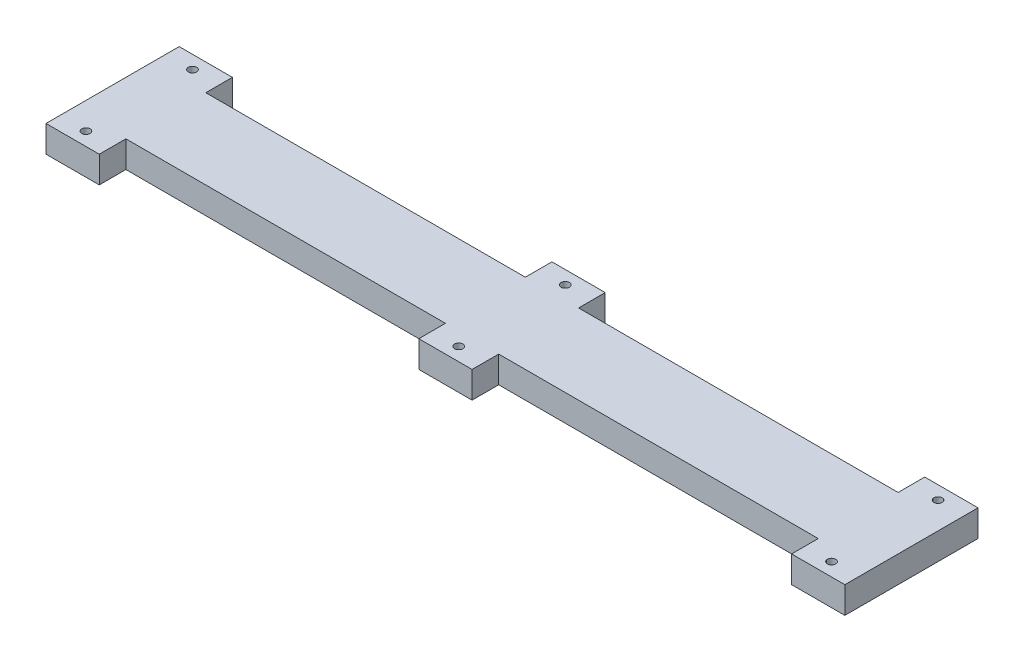
ISO-10303-21;
HEADER;
FILE_DESCRIPTION(('STEP AP214'),'2;1');
FILE_NAME('part.step','',(''),(''),'','','');
FILE_SCHEMA(('AUTOMOTIVE_DESIGN { 1 0 10303 214 1 1 1 1 }'));
ENDSEC;
DATA;
#1=APPLICATION_CONTEXT('core data for automotive mechanical design processes');
#2=APPLICATION_PROTOCOL_DEFINITION('international standard','automotive_design',2000,#1);
#3=PRODUCT_CONTEXT('',#1,'mechanical');
#4=PRODUCT('Part','Part','',(#3));
#5=PRODUCT_RELATED_PRODUCT_CATEGORY('part','',(#4));
#6=PRODUCT_DEFINITION_FORMATION('','',#4);
#7=PRODUCT_DEFINITION_CONTEXT('part definition',#1,'design');
#8=PRODUCT_DEFINITION('design','',#6,#7);
#9=PRODUCT_DEFINITION_SHAPE('','',#8);
#10=(LENGTH_UNIT() NAMED_UNIT(*) SI_UNIT(.MILLI.,.METRE.));
#11=(NAMED_UNIT(*) PLANE_ANGLE_UNIT() SI_UNIT($,.RADIAN.));
#12=(NAMED_UNIT(*) SI_UNIT($,.STERADIAN.) SOLID_ANGLE_UNIT());
#13=UNCERTAINTY_MEASURE_WITH_UNIT(LENGTH_MEASURE(1.E-05),#10,'distance_accuracy_value','');
#14=(GEOMETRIC_REPRESENTATION_CONTEXT(3) GLOBAL_UNCERTAINTY_ASSIGNED_CONTEXT((#13)) GLOBAL_UNIT_ASSIGNED_CONTEXT((#10,
#11,#12)) REPRESENTATION_CONTEXT('',''));
#15=CARTESIAN_POINT('',(0.,0.,0.));
#16=DIRECTION('',(0.,0.,1.));
#17=DIRECTION('',(1.,0.,0.));
#18=AXIS2_PLACEMENT_3D('',#15,#16,#17);
#19=CARTESIAN_POINT('',(-150.,10.,-25.));
#20=DIRECTION('',(0.,0.,1.));
#21=DIRECTION('',(1.,0.,0.));
#22=AXIS2_PLACEMENT_3D('',#19,#20,#21);
#23=PLANE('',#22);
#24=DIRECTION('',(-1.,0.,0.));
#25=VECTOR('',#24,1.);
#26=CARTESIAN_POINT('',(-150.,0.,-25.));
#27=LINE('',#26,#25);
#28=CARTESIAN_POINT('',(150.,0.,-25.));
#29=VERTEX_POINT('',#28);
#30=CARTESIAN_POINT('',(130.,0.,-25.));
#31=VERTEX_POINT('',#30);
#32=EDGE_CURVE('E194',#29,#31,#27,.T.);
#33=ORIENTED_EDGE('',*,*,#32,.T.);
#34=DIRECTION('',(0.,1.,0.));
#35=VECTOR('',#34,1.);
#36=CARTESIAN_POINT('',(130.,0.,-25.));
#37=LINE('',#36,#35);
#38=CARTESIAN_POINT('',(130.,10.,-25.));
#39=VERTEX_POINT('',#38);
#40=EDGE_CURVE('E320',#31,#39,#37,.T.);
#41=ORIENTED_EDGE('',*,*,#40,.T.);
#42=DIRECTION('',(-1.,0.,0.));
#43=VECTOR('',#42,1.);
#44=CARTESIAN_POINT('',(-150.,10.,-25.));
#45=LINE('',#44,#43);
#46=CARTESIAN_POINT('',(150.,10.,-25.));
#47=VERTEX_POINT('',#46);
#48=EDGE_CURVE('E249',#47,#39,#45,.T.);
#49=ORIENTED_EDGE('',*,*,#48,.F.);
#50=DIRECTION('',(0.,-1.,0.));
#51=VECTOR('',#50,1.);
#52=CARTESIAN_POINT('',(150.,10.,-25.));
#53=LINE('',#52,#51);
#54=EDGE_CURVE('E11',#47,#29,#53,.T.);
#55=ORIENTED_EDGE('',*,*,#54,.T.);
#56=EDGE_LOOP('',(#33,#41,#49,#55));
#57=FACE_BOUND('',#56,.T.);
#58=ADVANCED_FACE('F35',(#57),#23,.F.);
#59=CARTESIAN_POINT('',(-130.,10.,-25.));
#60=VERTEX_POINT('',#59);
#61=CARTESIAN_POINT('',(-150.,10.,-25.));
#62=VERTEX_POINT('',#61);
#63=EDGE_CURVE('E252',#60,#62,#45,.T.);
#64=ORIENTED_EDGE('',*,*,#63,.F.);
#65=DIRECTION('',(0.,1.,0.));
#66=VECTOR('',#65,1.);
#67=CARTESIAN_POINT('',(-130.,0.,-25.));
#68=LINE('',#67,#66);
#69=CARTESIAN_POINT('',(-130.,0.,-25.));
#70=VERTEX_POINT('',#69);
#71=EDGE_CURVE('E295',#70,#60,#68,.T.);
#72=ORIENTED_EDGE('',*,*,#71,.F.);
#73=CARTESIAN_POINT('',(-150.,0.,-25.));
#74=VERTEX_POINT('',#73);
#75=EDGE_CURVE('E195',#70,#74,#27,.T.);
#76=ORIENTED_EDGE('',*,*,#75,.T.);
#77=DIRECTION('',(0.,-1.,0.));
#78=VECTOR('',#77,1.);
#79=CARTESIAN_POINT('',(-150.,10.,-25.));
#80=LINE('',#79,#78);
#81=EDGE_CURVE('E43',#62,#74,#80,.T.);
#82=ORIENTED_EDGE('',*,*,#81,.F.);
#83=EDGE_LOOP('',(#64,#72,#76,#82));
#84=FACE_BOUND('',#83,.T.);
#85=ADVANCED_FACE('F442',(#84),#23,.F.);
#86=CARTESIAN_POINT('',(-150.,10.,25.));
#87=DIRECTION('',(0.,0.,-1.));
#88=DIRECTION('',(-1.,0.,0.));
#89=AXIS2_PLACEMENT_3D('',#86,#87,#88);
#90=PLANE('',#89);
#91=DIRECTION('',(1.,0.,0.));
#92=VECTOR('',#91,1.);
#93=CARTESIAN_POINT('',(-150.,0.,25.));
#94=LINE('',#93,#92);
#95=CARTESIAN_POINT('',(-10.,0.,25.));
#96=VERTEX_POINT('',#95);
#97=CARTESIAN_POINT('',(9.99999999999995,0.,25.));
#98=VERTEX_POINT('',#97);
#99=EDGE_CURVE('E209',#96,#98,#94,.T.);
#100=ORIENTED_EDGE('',*,*,#99,.T.);
#101=DIRECTION('',(0.,1.,0.));
#102=VECTOR('',#101,1.);
#103=CARTESIAN_POINT('',(9.99999999999995,0.,25.));
#104=LINE('',#103,#102);
#105=CARTESIAN_POINT('',(9.99999999999995,10.,25.));
#106=VERTEX_POINT('',#105);
#107=EDGE_CURVE('E271',#98,#106,#104,.T.);
#108=ORIENTED_EDGE('',*,*,#107,.T.);
#109=DIRECTION('',(1.,0.,0.));
#110=VECTOR('',#109,1.);
#111=CARTESIAN_POINT('',(-150.,10.,25.));
#112=LINE('',#111,#110);
#113=CARTESIAN_POINT('',(-10.,10.,25.));
#114=VERTEX_POINT('',#113);
#115=EDGE_CURVE('E241',#114,#106,#112,.T.);
#116=ORIENTED_EDGE('',*,*,#115,.F.);
#117=DIRECTION('',(0.,1.,0.));
#118=VECTOR('',#117,1.);
#119=CARTESIAN_POINT('',(-10.,0.,25.));
#120=LINE('',#119,#118);
#121=EDGE_CURVE('E256',#96,#114,#120,.T.);
#122=ORIENTED_EDGE('',*,*,#121,.F.);
#123=EDGE_LOOP('',(#100,#108,#116,#122));
#124=FACE_BOUND('',#123,.T.);
#125=ADVANCED_FACE('F416',(#124),#90,.F.);
#126=CARTESIAN_POINT('',(-150.,0.,25.));
#127=VERTEX_POINT('',#126);
#128=CARTESIAN_POINT('',(-130.,0.,25.));
#129=VERTEX_POINT('',#128);
#130=EDGE_CURVE('E205',#127,#129,#94,.T.);
#131=ORIENTED_EDGE('',*,*,#130,.T.);
#132=DIRECTION('',(0.,1.,0.));
#133=VECTOR('',#132,1.);
#134=CARTESIAN_POINT('',(-130.,0.,25.));
#135=LINE('',#134,#133);
#136=CARTESIAN_POINT('',(-130.,10.,25.));
#137=VERTEX_POINT('',#136);
#138=EDGE_CURVE('E237',#129,#137,#135,.T.);
#139=ORIENTED_EDGE('',*,*,#138,.T.);
#140=CARTESIAN_POINT('',(-150.,10.,25.));
#141=VERTEX_POINT('',#140);
#142=EDGE_CURVE('E214',#141,#137,#112,.T.);
#143=ORIENTED_EDGE('',*,*,#142,.F.);
#144=DIRECTION('',(0.,-1.,0.));
#145=VECTOR('',#144,1.);
#146=CARTESIAN_POINT('',(-150.,10.,25.));
#147=LINE('',#146,#145);
#148=EDGE_CURVE('E213',#141,#127,#147,.T.);
#149=ORIENTED_EDGE('',*,*,#148,.T.);
#150=EDGE_LOOP('',(#131,#139,#143,#149));
#151=FACE_BOUND('',#150,.T.);
#152=ADVANCED_FACE('F235',(#151),#90,.F.);
#153=CARTESIAN_POINT('',(150.,10.,25.));
#154=DIRECTION('',(-1.,0.,0.));
#155=DIRECTION('',(0.,0.,1.));
#156=AXIS2_PLACEMENT_3D('',#153,#154,#155);
#157=PLANE('',#156);
#158=DIRECTION('',(0.,0.,-1.));
#159=VECTOR('',#158,1.);
#160=CARTESIAN_POINT('',(150.,0.,25.));
#161=LINE('',#160,#159);
#162=CARTESIAN_POINT('',(150.,0.,25.));
#163=VERTEX_POINT('',#162);
#164=EDGE_CURVE('E199',#163,#29,#161,.T.);
#165=ORIENTED_EDGE('',*,*,#164,.T.);
#166=ORIENTED_EDGE('',*,*,#54,.F.);
#167=DIRECTION('',(0.,0.,-1.));
#168=VECTOR('',#167,1.);
#169=CARTESIAN_POINT('',(150.,10.,25.));
#170=LINE('',#169,#168);
#171=CARTESIAN_POINT('',(150.,10.,25.));
#172=VERTEX_POINT('',#171);
#173=EDGE_CURVE('E208',#172,#47,#170,.T.);
#174=ORIENTED_EDGE('',*,*,#173,.F.);
#175=DIRECTION('',(0.,-1.,0.));
#176=VECTOR('',#175,1.);
#177=CARTESIAN_POINT('',(150.,10.,25.));
#178=LINE('',#177,#176);
#179=EDGE_CURVE('E210',#172,#163,#178,.T.);
#180=ORIENTED_EDGE('',*,*,#179,.T.);
#181=EDGE_LOOP('',(#165,#166,#174,#180));
#182=FACE_BOUND('',#181,.T.);
#183=ADVANCED_FACE('F37',(#182),#157,.F.);
#184=CARTESIAN_POINT('',(9.99999999999995,10.,-25.));
#185=VERTEX_POINT('',#184);
#186=CARTESIAN_POINT('',(-10.,10.,-25.));
#187=VERTEX_POINT('',#186);
#188=EDGE_CURVE('E188',#185,#187,#45,.T.);
#189=ORIENTED_EDGE('',*,*,#188,.F.);
#190=DIRECTION('',(0.,1.,0.));
#191=VECTOR('',#190,1.);
#192=CARTESIAN_POINT('',(9.99999999999995,0.,-25.));
#193=LINE('',#192,#191);
#194=CARTESIAN_POINT('',(9.99999999999995,0.,-25.));
#195=VERTEX_POINT('',#194);
#196=EDGE_CURVE('E176',#195,#185,#193,.T.);
#197=ORIENTED_EDGE('',*,*,#196,.F.);
#198=CARTESIAN_POINT('',(-10.,0.,-25.));
#199=VERTEX_POINT('',#198);
#200=EDGE_CURVE('E187',#195,#199,#27,.T.);
#201=ORIENTED_EDGE('',*,*,#200,.T.);
#202=DIRECTION('',(0.,1.,0.));
#203=VECTOR('',#202,1.);
#204=CARTESIAN_POINT('',(-10.,0.,-25.));
#205=LINE('',#204,#203);
#206=EDGE_CURVE('E307',#199,#187,#205,.T.);
#207=ORIENTED_EDGE('',*,*,#206,.T.);
#208=EDGE_LOOP('',(#189,#197,#201,#207));
#209=FACE_BOUND('',#208,.T.);
#210=ADVANCED_FACE('F185',(#209),#23,.F.);
#211=CARTESIAN_POINT('',(-150.,10.,25.));
#212=DIRECTION('',(1.,0.,0.));
#213=DIRECTION('',(0.,0.,-1.));
#214=AXIS2_PLACEMENT_3D('',#211,#212,#213);
#215=PLANE('',#214);
#216=DIRECTION('',(0.,0.,1.));
#217=VECTOR('',#216,1.);
#218=CARTESIAN_POINT('',(-150.,0.,25.));
#219=LINE('',#218,#217);
#220=EDGE_CURVE('E198',#74,#127,#219,.T.);
#221=ORIENTED_EDGE('',*,*,#220,.T.);
#222=ORIENTED_EDGE('',*,*,#148,.F.);
#223=DIRECTION('',(0.,0.,1.));
#224=VECTOR('',#223,1.);
#225=CARTESIAN_POINT('',(-150.,10.,25.));
#226=LINE('',#225,#224);
#227=EDGE_CURVE('E223',#62,#141,#226,.T.);
#228=ORIENTED_EDGE('',*,*,#227,.F.);
#229=ORIENTED_EDGE('',*,*,#81,.T.);
#230=EDGE_LOOP('',(#221,#222,#228,#229));
#231=FACE_BOUND('',#230,.T.);
#232=ADVANCED_FACE('F221',(#231),#215,.F.);
#233=CARTESIAN_POINT('',(130.,10.,25.));
#234=VERTEX_POINT('',#233);
#235=EDGE_CURVE('E242',#234,#172,#112,.T.);
#236=ORIENTED_EDGE('',*,*,#235,.F.);
#237=DIRECTION('',(0.,1.,0.));
#238=VECTOR('',#237,1.);
#239=CARTESIAN_POINT('',(130.,0.,25.));
#240=LINE('',#239,#238);
#241=CARTESIAN_POINT('',(130.,0.,25.));
#242=VERTEX_POINT('',#241);
#243=EDGE_CURVE('E277',#242,#234,#240,.T.);
#244=ORIENTED_EDGE('',*,*,#243,.F.);
#245=EDGE_CURVE('E204',#242,#163,#94,.T.);
#246=ORIENTED_EDGE('',*,*,#245,.T.);
#247=ORIENTED_EDGE('',*,*,#179,.F.);
#248=EDGE_LOOP('',(#236,#244,#246,#247));
#249=FACE_BOUND('',#248,.T.);
#250=ADVANCED_FACE('F387',(#249),#90,.F.);
#251=CARTESIAN_POINT('',(0.,10.,0.));
#252=DIRECTION('',(0.,-1.,0.));
#253=DIRECTION('',(0.,0.,-1.));
#254=AXIS2_PLACEMENT_3D('',#251,#252,#253);
#255=PLANE('',#254);
#256=CARTESIAN_POINT('',(140.,10.,20.));
#257=DIRECTION('',(0.,1.,0.));
#258=DIRECTION('',(0.,0.,1.));
#259=AXIS2_PLACEMENT_3D('',#256,#257,#258);
#260=CIRCLE('',#259,1.54999999999999);
#261=CARTESIAN_POINT('',(140.,10.,21.55));
#262=VERTEX_POINT('',#261);
#263=EDGE_CURVE('E369',#262,#262,#260,.T.);
#264=ORIENTED_EDGE('',*,*,#263,.F.);
#265=EDGE_LOOP('',(#264));
#266=FACE_BOUND('',#265,.T.);
#267=CARTESIAN_POINT('',(-140.,10.,20.000000000002));
#268=DIRECTION('',(0.,1.,0.));
#269=DIRECTION('',(0.,0.,1.));
#270=AXIS2_PLACEMENT_3D('',#267,#268,#269);
#271=CIRCLE('',#270,1.54999999999999);
#272=CARTESIAN_POINT('',(-140.,10.,21.550000000002));
#273=VERTEX_POINT('',#272);
#274=EDGE_CURVE('E363',#273,#273,#271,.T.);
#275=ORIENTED_EDGE('',*,*,#274,.F.);
#276=EDGE_LOOP('',(#275));
#277=FACE_BOUND('',#276,.T.);
#278=CARTESIAN_POINT('',(3.60822483003176E-13,10.,20.000000000001));
#279=DIRECTION('',(0.,1.,0.));
#280=DIRECTION('',(0.,0.,1.));
#281=AXIS2_PLACEMENT_3D('',#278,#279,#280);
#282=CIRCLE('',#281,1.54999999999999);
#283=CARTESIAN_POINT('',(3.60822483003176E-13,10.,21.550000000001));
#284=VERTEX_POINT('',#283);
#285=EDGE_CURVE('E357',#284,#284,#282,.T.);
#286=ORIENTED_EDGE('',*,*,#285,.F.);
#287=EDGE_LOOP('',(#286));
#288=FACE_BOUND('',#287,.T.);
#289=CARTESIAN_POINT('',(-140.,10.,-19.999999999998));
#290=DIRECTION('',(0.,1.,0.));
#291=DIRECTION('',(0.,0.,1.));
#292=AXIS2_PLACEMENT_3D('',#289,#290,#291);
#293=CIRCLE('',#292,1.54999999999999);
#294=CARTESIAN_POINT('',(-140.,10.,-18.449999999998));
#295=VERTEX_POINT('',#294);
#296=EDGE_CURVE('E351',#295,#295,#293,.T.);
#297=ORIENTED_EDGE('',*,*,#296,.F.);
#298=EDGE_LOOP('',(#297));
#299=FACE_BOUND('',#298,.T.);
#300=CARTESIAN_POINT('',(0.,10.,-19.999999999999));
#301=DIRECTION('',(0.,1.,0.));
#302=DIRECTION('',(0.,0.,1.));
#303=AXIS2_PLACEMENT_3D('',#300,#301,#302);
#304=CIRCLE('',#303,1.54999999999999);
#305=CARTESIAN_POINT('',(0.,10.,-18.449999999999));
#306=VERTEX_POINT('',#305);
#307=EDGE_CURVE('E345',#306,#306,#304,.T.);
#308=ORIENTED_EDGE('',*,*,#307,.F.);
#309=EDGE_LOOP('',(#308));
#310=FACE_BOUND('',#309,.T.);
#311=CARTESIAN_POINT('',(140.,10.,-20.));
#312=DIRECTION('',(0.,1.,0.));
#313=DIRECTION('',(0.,0.,1.));
#314=AXIS2_PLACEMENT_3D('',#311,#312,#313);
#315=CIRCLE('',#314,1.54999999999999);
#316=CARTESIAN_POINT('',(140.,10.,-18.45));
#317=VERTEX_POINT('',#316);
#318=EDGE_CURVE('E339',#317,#317,#315,.T.);
#319=ORIENTED_EDGE('',*,*,#318,.F.);
#320=EDGE_LOOP('',(#319));
#321=FACE_BOUND('',#320,.T.);
#322=ORIENTED_EDGE('',*,*,#48,.T.);
#323=DIRECTION('',(0.,0.,-1.));
#324=VECTOR('',#323,1.);
#325=CARTESIAN_POINT('',(130.,10.,-25.));
#326=LINE('',#325,#324);
#327=CARTESIAN_POINT('',(130.,10.,-15.0000000000001));
#328=VERTEX_POINT('',#327);
#329=EDGE_CURVE('E181',#328,#39,#326,.T.);
#330=ORIENTED_EDGE('',*,*,#329,.F.);
#331=DIRECTION('',(1.,0.,0.));
#332=VECTOR('',#331,1.);
#333=CARTESIAN_POINT('',(9.99999999999996,10.,-15.0000000000001));
#334=LINE('',#333,#332);
#335=CARTESIAN_POINT('',(9.99999999999996,10.,-15.0000000000001));
#336=VERTEX_POINT('',#335);
#337=EDGE_CURVE('E331',#336,#328,#334,.T.);
#338=ORIENTED_EDGE('',*,*,#337,.F.);
#339=DIRECTION('',(0.,0.,1.));
#340=VECTOR('',#339,1.);
#341=CARTESIAN_POINT('',(9.99999999999995,10.,-25.));
#342=LINE('',#341,#340);
#343=EDGE_CURVE('E334',#185,#336,#342,.T.);
#344=ORIENTED_EDGE('',*,*,#343,.F.);
#345=ORIENTED_EDGE('',*,*,#188,.T.);
#346=DIRECTION('',(0.,0.,-1.));
#347=VECTOR('',#346,1.);
#348=CARTESIAN_POINT('',(-10.,10.,-25.));
#349=LINE('',#348,#347);
#350=CARTESIAN_POINT('',(-10.,10.,-15.));
#351=VERTEX_POINT('',#350);
#352=EDGE_CURVE('E310',#351,#187,#349,.T.);
#353=ORIENTED_EDGE('',*,*,#352,.F.);
#354=DIRECTION('',(1.,0.,0.));
#355=VECTOR('',#354,1.);
#356=CARTESIAN_POINT('',(-130.,10.,-15.));
#357=LINE('',#356,#355);
#358=CARTESIAN_POINT('',(-130.,10.,-15.));
#359=VERTEX_POINT('',#358);
#360=EDGE_CURVE('E314',#359,#351,#357,.T.);
#361=ORIENTED_EDGE('',*,*,#360,.F.);
#362=DIRECTION('',(0.,0.,1.));
#363=VECTOR('',#362,1.);
#364=CARTESIAN_POINT('',(-130.,10.,-25.));
#365=LINE('',#364,#363);
#366=EDGE_CURVE('E317',#60,#359,#365,.T.);
#367=ORIENTED_EDGE('',*,*,#366,.F.);
#368=ORIENTED_EDGE('',*,*,#63,.T.);
#369=ORIENTED_EDGE('',*,*,#227,.T.);
#370=ORIENTED_EDGE('',*,*,#142,.T.);
#371=DIRECTION('',(0.,0.,1.));
#372=VECTOR('',#371,1.);
#373=CARTESIAN_POINT('',(-130.,10.,25.));
#374=LINE('',#373,#372);
#375=CARTESIAN_POINT('',(-130.,10.,15.));
#376=VERTEX_POINT('',#375);
#377=EDGE_CURVE('E269',#376,#137,#374,.T.);
#378=ORIENTED_EDGE('',*,*,#377,.F.);
#379=DIRECTION('',(-1.,0.,0.));
#380=VECTOR('',#379,1.);
#381=CARTESIAN_POINT('',(-130.,10.,15.));
#382=LINE('',#381,#380);
#383=CARTESIAN_POINT('',(-10.,10.,15.));
#384=VERTEX_POINT('',#383);
#385=EDGE_CURVE('E263',#384,#376,#382,.T.);
#386=ORIENTED_EDGE('',*,*,#385,.F.);
#387=DIRECTION('',(0.,0.,-1.));
#388=VECTOR('',#387,1.);
#389=CARTESIAN_POINT('',(-10.,10.,25.));
#390=LINE('',#389,#388);
#391=EDGE_CURVE('E266',#114,#384,#390,.T.);
#392=ORIENTED_EDGE('',*,*,#391,.F.);
#393=ORIENTED_EDGE('',*,*,#115,.T.);
#394=DIRECTION('',(0.,0.,1.));
#395=VECTOR('',#394,1.);
#396=CARTESIAN_POINT('',(9.99999999999995,10.,25.));
#397=LINE('',#396,#395);
#398=CARTESIAN_POINT('',(9.99999999999997,10.,14.9999999999999));
#399=VERTEX_POINT('',#398);
#400=EDGE_CURVE('E286',#399,#106,#397,.T.);
#401=ORIENTED_EDGE('',*,*,#400,.F.);
#402=DIRECTION('',(-1.,0.,0.));
#403=VECTOR('',#402,1.);
#404=CARTESIAN_POINT('',(9.99999999999997,10.,14.9999999999999));
#405=LINE('',#404,#403);
#406=CARTESIAN_POINT('',(130.,10.,14.9999999999999));
#407=VERTEX_POINT('',#406);
#408=EDGE_CURVE('E289',#407,#399,#405,.T.);
#409=ORIENTED_EDGE('',*,*,#408,.F.);
#410=DIRECTION('',(0.,0.,-1.));
#411=VECTOR('',#410,1.);
#412=CARTESIAN_POINT('',(130.,10.,25.));
#413=LINE('',#412,#411);
#414=EDGE_CURVE('E292',#234,#407,#413,.T.);
#415=ORIENTED_EDGE('',*,*,#414,.F.);
#416=ORIENTED_EDGE('',*,*,#235,.T.);
#417=ORIENTED_EDGE('',*,*,#173,.T.);
#418=EDGE_LOOP('',(#322,#330,#338,#344,#345,#353,#361,#367,#368,#369,#370,#378,#386,#392,#393,
#401,#409,#415,#416,#417));
#419=FACE_BOUND('',#418,.T.);
#420=ADVANCED_FACE('F384',(#266,#277,#288,#299,#310,#321,#419),#255,.F.);
#421=CARTESIAN_POINT('',(0.,0.,0.));
#422=DIRECTION('',(0.,-1.,0.));
#423=DIRECTION('',(0.,0.,-1.));
#424=AXIS2_PLACEMENT_3D('',#421,#422,#423);
#425=PLANE('',#424);
#426=CARTESIAN_POINT('',(140.,0.,20.));
#427=DIRECTION('',(0.,1.,0.));
#428=DIRECTION('',(0.,0.,1.));
#429=AXIS2_PLACEMENT_3D('',#426,#427,#428);
#430=CIRCLE('',#429,1.54999999999999);
#431=CARTESIAN_POINT('',(140.,0.,21.55));
#432=VERTEX_POINT('',#431);
#433=EDGE_CURVE('E366',#432,#432,#430,.T.);
#434=ORIENTED_EDGE('',*,*,#433,.T.);
#435=EDGE_LOOP('',(#434));
#436=FACE_BOUND('',#435,.T.);
#437=CARTESIAN_POINT('',(-140.,0.,20.000000000002));
#438=DIRECTION('',(0.,1.,0.));
#439=DIRECTION('',(0.,0.,1.));
#440=AXIS2_PLACEMENT_3D('',#437,#438,#439);
#441=CIRCLE('',#440,1.54999999999999);
#442=CARTESIAN_POINT('',(-140.,0.,21.550000000002));
#443=VERTEX_POINT('',#442);
#444=EDGE_CURVE('E360',#443,#443,#441,.T.);
#445=ORIENTED_EDGE('',*,*,#444,.T.);
#446=EDGE_LOOP('',(#445));
#447=FACE_BOUND('',#446,.T.);
#448=CARTESIAN_POINT('',(3.60822483003176E-13,0.,20.000000000001));
#449=DIRECTION('',(0.,1.,0.));
#450=DIRECTION('',(0.,0.,1.));
#451=AXIS2_PLACEMENT_3D('',#448,#449,#450);
#452=CIRCLE('',#451,1.54999999999999);
#453=CARTESIAN_POINT('',(3.60822483003176E-13,0.,21.550000000001));
#454=VERTEX_POINT('',#453);
#455=EDGE_CURVE('E354',#454,#454,#452,.T.);
#456=ORIENTED_EDGE('',*,*,#455,.T.);
#457=EDGE_LOOP('',(#456));
#458=FACE_BOUND('',#457,.T.);
#459=CARTESIAN_POINT('',(-140.,0.,-19.999999999998));
#460=DIRECTION('',(0.,1.,0.));
#461=DIRECTION('',(0.,0.,1.));
#462=AXIS2_PLACEMENT_3D('',#459,#460,#461);
#463=CIRCLE('',#462,1.54999999999999);
#464=CARTESIAN_POINT('',(-140.,0.,-18.449999999998));
#465=VERTEX_POINT('',#464);
#466=EDGE_CURVE('E348',#465,#465,#463,.T.);
#467=ORIENTED_EDGE('',*,*,#466,.T.);
#468=EDGE_LOOP('',(#467));
#469=FACE_BOUND('',#468,.T.);
#470=CARTESIAN_POINT('',(0.,0.,-19.999999999999));
#471=DIRECTION('',(0.,1.,0.));
#472=DIRECTION('',(0.,0.,1.));
#473=AXIS2_PLACEMENT_3D('',#470,#471,#472);
#474=CIRCLE('',#473,1.54999999999999);
#475=CARTESIAN_POINT('',(0.,0.,-18.449999999999));
#476=VERTEX_POINT('',#475);
#477=EDGE_CURVE('E342',#476,#476,#474,.T.);
#478=ORIENTED_EDGE('',*,*,#477,.T.);
#479=EDGE_LOOP('',(#478));
#480=FACE_BOUND('',#479,.T.);
#481=CARTESIAN_POINT('',(140.,0.,-20.));
#482=DIRECTION('',(0.,1.,0.));
#483=DIRECTION('',(0.,0.,1.));
#484=AXIS2_PLACEMENT_3D('',#481,#482,#483);
#485=CIRCLE('',#484,1.54999999999999);
#486=CARTESIAN_POINT('',(140.,0.,-18.45));
#487=VERTEX_POINT('',#486);
#488=EDGE_CURVE('E336',#487,#487,#485,.T.);
#489=ORIENTED_EDGE('',*,*,#488,.T.);
#490=EDGE_LOOP('',(#489));
#491=FACE_BOUND('',#490,.T.);
#492=DIRECTION('',(0.,0.,-1.));
#493=VECTOR('',#492,1.);
#494=CARTESIAN_POINT('',(130.,0.,-25.));
#495=LINE('',#494,#493);
#496=CARTESIAN_POINT('',(130.,0.,-15.0000000000001));
#497=VERTEX_POINT('',#496);
#498=EDGE_CURVE('E189',#497,#31,#495,.T.);
#499=ORIENTED_EDGE('',*,*,#498,.T.);
#500=ORIENTED_EDGE('',*,*,#32,.F.);
#501=ORIENTED_EDGE('',*,*,#164,.F.);
#502=ORIENTED_EDGE('',*,*,#245,.F.);
#503=DIRECTION('',(0.,0.,-1.));
#504=VECTOR('',#503,1.);
#505=CARTESIAN_POINT('',(130.,0.,25.));
#506=LINE('',#505,#504);
#507=CARTESIAN_POINT('',(130.,0.,14.9999999999999));
#508=VERTEX_POINT('',#507);
#509=EDGE_CURVE('E288',#242,#508,#506,.T.);
#510=ORIENTED_EDGE('',*,*,#509,.T.);
#511=DIRECTION('',(-1.,0.,0.));
#512=VECTOR('',#511,1.);
#513=CARTESIAN_POINT('',(9.99999999999997,0.,14.9999999999999));
#514=LINE('',#513,#512);
#515=CARTESIAN_POINT('',(9.99999999999997,0.,14.9999999999999));
#516=VERTEX_POINT('',#515);
#517=EDGE_CURVE('E298',#508,#516,#514,.T.);
#518=ORIENTED_EDGE('',*,*,#517,.T.);
#519=DIRECTION('',(0.,0.,1.));
#520=VECTOR('',#519,1.);
#521=CARTESIAN_POINT('',(9.99999999999995,0.,25.));
#522=LINE('',#521,#520);
#523=EDGE_CURVE('E280',#516,#98,#522,.T.);
#524=ORIENTED_EDGE('',*,*,#523,.T.);
#525=ORIENTED_EDGE('',*,*,#99,.F.);
#526=DIRECTION('',(0.,0.,-1.));
#527=VECTOR('',#526,1.);
#528=CARTESIAN_POINT('',(-10.,0.,25.));
#529=LINE('',#528,#527);
#530=CARTESIAN_POINT('',(-10.,0.,15.));
#531=VERTEX_POINT('',#530);
#532=EDGE_CURVE('E273',#96,#531,#529,.T.);
#533=ORIENTED_EDGE('',*,*,#532,.T.);
#534=DIRECTION('',(-1.,0.,0.));
#535=VECTOR('',#534,1.);
#536=CARTESIAN_POINT('',(-130.,0.,15.));
#537=LINE('',#536,#535);
#538=CARTESIAN_POINT('',(-130.,0.,15.));
#539=VERTEX_POINT('',#538);
#540=EDGE_CURVE('E257',#531,#539,#537,.T.);
#541=ORIENTED_EDGE('',*,*,#540,.T.);
#542=DIRECTION('',(0.,0.,1.));
#543=VECTOR('',#542,1.);
#544=CARTESIAN_POINT('',(-130.,0.,25.));
#545=LINE('',#544,#543);
#546=EDGE_CURVE('E232',#539,#129,#545,.T.);
#547=ORIENTED_EDGE('',*,*,#546,.T.);
#548=ORIENTED_EDGE('',*,*,#130,.F.);
#549=ORIENTED_EDGE('',*,*,#220,.F.);
#550=ORIENTED_EDGE('',*,*,#75,.F.);
#551=DIRECTION('',(0.,0.,1.));
#552=VECTOR('',#551,1.);
#553=CARTESIAN_POINT('',(-130.,0.,-25.));
#554=LINE('',#553,#552);
#555=CARTESIAN_POINT('',(-130.,0.,-15.));
#556=VERTEX_POINT('',#555);
#557=EDGE_CURVE('E313',#70,#556,#554,.T.);
#558=ORIENTED_EDGE('',*,*,#557,.T.);
#559=DIRECTION('',(1.,0.,0.));
#560=VECTOR('',#559,1.);
#561=CARTESIAN_POINT('',(-130.,0.,-15.));
#562=LINE('',#561,#560);
#563=CARTESIAN_POINT('',(-10.,0.,-15.));
#564=VERTEX_POINT('',#563);
#565=EDGE_CURVE('E322',#556,#564,#562,.T.);
#566=ORIENTED_EDGE('',*,*,#565,.T.);
#567=DIRECTION('',(0.,0.,-1.));
#568=VECTOR('',#567,1.);
#569=CARTESIAN_POINT('',(-10.,0.,-25.));
#570=LINE('',#569,#568);
#571=EDGE_CURVE('E58',#564,#199,#570,.T.);
#572=ORIENTED_EDGE('',*,*,#571,.T.);
#573=ORIENTED_EDGE('',*,*,#200,.F.);
#574=DIRECTION('',(0.,0.,1.));
#575=VECTOR('',#574,1.);
#576=CARTESIAN_POINT('',(9.99999999999995,0.,-25.));
#577=LINE('',#576,#575);
#578=CARTESIAN_POINT('',(9.99999999999996,0.,-15.0000000000001));
#579=VERTEX_POINT('',#578);
#580=EDGE_CURVE('E172',#195,#579,#577,.T.);
#581=ORIENTED_EDGE('',*,*,#580,.T.);
#582=DIRECTION('',(1.,0.,0.));
#583=VECTOR('',#582,1.);
#584=CARTESIAN_POINT('',(9.99999999999996,0.,-15.0000000000001));
#585=LINE('',#584,#583);
#586=EDGE_CURVE('E50',#579,#497,#585,.T.);
#587=ORIENTED_EDGE('',*,*,#586,.T.);
#588=EDGE_LOOP('',(#499,#500,#501,#502,#510,#518,#524,#525,#533,#541,#547,#548,#549,#550,#558,
#566,#572,#573,#581,#587));
#589=FACE_BOUND('',#588,.T.);
#590=ADVANCED_FACE('F192',(#436,#447,#458,#469,#480,#491,#589),#425,.T.);
#591=CARTESIAN_POINT('',(-130.,0.,25.));
#592=DIRECTION('',(-1.,0.,0.));
#593=DIRECTION('',(0.,0.,1.));
#594=AXIS2_PLACEMENT_3D('',#591,#592,#593);
#595=PLANE('',#594);
#596=ORIENTED_EDGE('',*,*,#377,.T.);
#597=ORIENTED_EDGE('',*,*,#138,.F.);
#598=ORIENTED_EDGE('',*,*,#546,.F.);
#599=DIRECTION('',(0.,1.,0.));
#600=VECTOR('',#599,1.);
#601=CARTESIAN_POINT('',(-130.,0.,15.));
#602=LINE('',#601,#600);
#603=EDGE_CURVE('E261',#539,#376,#602,.T.);
#604=ORIENTED_EDGE('',*,*,#603,.T.);
#605=EDGE_LOOP('',(#596,#597,#598,#604));
#606=FACE_BOUND('',#605,.T.);
#607=ADVANCED_FACE('F431',(#606),#595,.F.);
#608=CARTESIAN_POINT('',(-130.,0.,15.));
#609=DIRECTION('',(0.,0.,-1.));
#610=DIRECTION('',(-1.,0.,0.));
#611=AXIS2_PLACEMENT_3D('',#608,#609,#610);
#612=PLANE('',#611);
#613=ORIENTED_EDGE('',*,*,#385,.T.);
#614=ORIENTED_EDGE('',*,*,#603,.F.);
#615=ORIENTED_EDGE('',*,*,#540,.F.);
#616=DIRECTION('',(0.,1.,0.));
#617=VECTOR('',#616,1.);
#618=CARTESIAN_POINT('',(-10.,0.,15.));
#619=LINE('',#618,#617);
#620=EDGE_CURVE('E259',#531,#384,#619,.T.);
#621=ORIENTED_EDGE('',*,*,#620,.T.);
#622=EDGE_LOOP('',(#613,#614,#615,#621));
#623=FACE_BOUND('',#622,.T.);
#624=ADVANCED_FACE('F429',(#623),#612,.F.);
#625=CARTESIAN_POINT('',(-10.,0.,25.));
#626=DIRECTION('',(1.,0.,0.));
#627=DIRECTION('',(0.,0.,-1.));
#628=AXIS2_PLACEMENT_3D('',#625,#626,#627);
#629=PLANE('',#628);
#630=ORIENTED_EDGE('',*,*,#391,.T.);
#631=ORIENTED_EDGE('',*,*,#620,.F.);
#632=ORIENTED_EDGE('',*,*,#532,.F.);
#633=ORIENTED_EDGE('',*,*,#121,.T.);
#634=EDGE_LOOP('',(#630,#631,#632,#633));
#635=FACE_BOUND('',#634,.T.);
#636=ADVANCED_FACE('F427',(#635),#629,.F.);
#637=CARTESIAN_POINT('',(9.99999999999995,0.,25.));
#638=DIRECTION('',(-1.,0.,0.));
#639=DIRECTION('',(0.,0.,1.));
#640=AXIS2_PLACEMENT_3D('',#637,#638,#639);
#641=PLANE('',#640);
#642=ORIENTED_EDGE('',*,*,#400,.T.);
#643=ORIENTED_EDGE('',*,*,#107,.F.);
#644=ORIENTED_EDGE('',*,*,#523,.F.);
#645=DIRECTION('',(0.,1.,0.));
#646=VECTOR('',#645,1.);
#647=CARTESIAN_POINT('',(9.99999999999997,0.,14.9999999999999));
#648=LINE('',#647,#646);
#649=EDGE_CURVE('E282',#516,#399,#648,.T.);
#650=ORIENTED_EDGE('',*,*,#649,.T.);
#651=EDGE_LOOP('',(#642,#643,#644,#650));
#652=FACE_BOUND('',#651,.T.);
#653=ADVANCED_FACE('F420',(#652),#641,.F.);
#654=CARTESIAN_POINT('',(9.99999999999997,0.,14.9999999999999));
#655=DIRECTION('',(0.,0.,-1.));
#656=DIRECTION('',(-1.,0.,0.));
#657=AXIS2_PLACEMENT_3D('',#654,#655,#656);
#658=PLANE('',#657);
#659=ORIENTED_EDGE('',*,*,#408,.T.);
#660=ORIENTED_EDGE('',*,*,#649,.F.);
#661=ORIENTED_EDGE('',*,*,#517,.F.);
#662=DIRECTION('',(0.,1.,0.));
#663=VECTOR('',#662,1.);
#664=CARTESIAN_POINT('',(130.,0.,14.9999999999999));
#665=LINE('',#664,#663);
#666=EDGE_CURVE('E279',#508,#407,#665,.T.);
#667=ORIENTED_EDGE('',*,*,#666,.T.);
#668=EDGE_LOOP('',(#659,#660,#661,#667));
#669=FACE_BOUND('',#668,.T.);
#670=ADVANCED_FACE('F500',(#669),#658,.F.);
#671=CARTESIAN_POINT('',(130.,0.,25.));
#672=DIRECTION('',(1.,0.,0.));
#673=DIRECTION('',(0.,0.,-1.));
#674=AXIS2_PLACEMENT_3D('',#671,#672,#673);
#675=PLANE('',#674);
#676=ORIENTED_EDGE('',*,*,#414,.T.);
#677=ORIENTED_EDGE('',*,*,#666,.F.);
#678=ORIENTED_EDGE('',*,*,#509,.F.);
#679=ORIENTED_EDGE('',*,*,#243,.T.);
#680=EDGE_LOOP('',(#676,#677,#678,#679));
#681=FACE_BOUND('',#680,.T.);
#682=ADVANCED_FACE('F509',(#681),#675,.F.);
#683=CARTESIAN_POINT('',(-130.,0.,-25.));
#684=DIRECTION('',(-1.,0.,0.));
#685=DIRECTION('',(0.,0.,1.));
#686=AXIS2_PLACEMENT_3D('',#683,#684,#685);
#687=PLANE('',#686);
#688=ORIENTED_EDGE('',*,*,#366,.T.);
#689=DIRECTION('',(0.,1.,0.));
#690=VECTOR('',#689,1.);
#691=CARTESIAN_POINT('',(-130.,0.,-15.));
#692=LINE('',#691,#690);
#693=EDGE_CURVE('E303',#556,#359,#692,.T.);
#694=ORIENTED_EDGE('',*,*,#693,.F.);
#695=ORIENTED_EDGE('',*,*,#557,.F.);
#696=ORIENTED_EDGE('',*,*,#71,.T.);
#697=EDGE_LOOP('',(#688,#694,#695,#696));
#698=FACE_BOUND('',#697,.T.);
#699=ADVANCED_FACE('F519',(#698),#687,.F.);
#700=CARTESIAN_POINT('',(-10.,0.,-25.));
#701=DIRECTION('',(1.,0.,0.));
#702=DIRECTION('',(0.,0.,-1.));
#703=AXIS2_PLACEMENT_3D('',#700,#701,#702);
#704=PLANE('',#703);
#705=ORIENTED_EDGE('',*,*,#352,.T.);
#706=ORIENTED_EDGE('',*,*,#206,.F.);
#707=ORIENTED_EDGE('',*,*,#571,.F.);
#708=DIRECTION('',(0.,1.,0.));
#709=VECTOR('',#708,1.);
#710=CARTESIAN_POINT('',(-10.,0.,-15.));
#711=LINE('',#710,#709);
#712=EDGE_CURVE('E305',#564,#351,#711,.T.);
#713=ORIENTED_EDGE('',*,*,#712,.T.);
#714=EDGE_LOOP('',(#705,#706,#707,#713));
#715=FACE_BOUND('',#714,.T.);
#716=ADVANCED_FACE('F529',(#715),#704,.F.);
#717=CARTESIAN_POINT('',(-130.,0.,-15.));
#718=DIRECTION('',(0.,0.,1.));
#719=DIRECTION('',(1.,0.,0.));
#720=AXIS2_PLACEMENT_3D('',#717,#718,#719);
#721=PLANE('',#720);
#722=ORIENTED_EDGE('',*,*,#360,.T.);
#723=ORIENTED_EDGE('',*,*,#712,.F.);
#724=ORIENTED_EDGE('',*,*,#565,.F.);
#725=ORIENTED_EDGE('',*,*,#693,.T.);
#726=EDGE_LOOP('',(#722,#723,#724,#725));
#727=FACE_BOUND('',#726,.T.);
#728=ADVANCED_FACE('F539',(#727),#721,.F.);
#729=CARTESIAN_POINT('',(130.,0.,-25.));
#730=DIRECTION('',(1.,0.,0.));
#731=DIRECTION('',(0.,0.,-1.));
#732=AXIS2_PLACEMENT_3D('',#729,#730,#731);
#733=PLANE('',#732);
#734=ORIENTED_EDGE('',*,*,#329,.T.);
#735=ORIENTED_EDGE('',*,*,#40,.F.);
#736=ORIENTED_EDGE('',*,*,#498,.F.);
#737=DIRECTION('',(0.,1.,0.));
#738=VECTOR('',#737,1.);
#739=CARTESIAN_POINT('',(130.,0.,-15.0000000000001));
#740=LINE('',#739,#738);
#741=EDGE_CURVE('E326',#497,#328,#740,.T.);
#742=ORIENTED_EDGE('',*,*,#741,.T.);
#743=EDGE_LOOP('',(#734,#735,#736,#742));
#744=FACE_BOUND('',#743,.T.);
#745=ADVANCED_FACE('F406',(#744),#733,.F.);
#746=CARTESIAN_POINT('',(9.99999999999996,0.,-15.0000000000001));
#747=DIRECTION('',(0.,0.,1.));
#748=DIRECTION('',(1.,0.,0.));
#749=AXIS2_PLACEMENT_3D('',#746,#747,#748);
#750=PLANE('',#749);
#751=ORIENTED_EDGE('',*,*,#337,.T.);
#752=ORIENTED_EDGE('',*,*,#741,.F.);
#753=ORIENTED_EDGE('',*,*,#586,.F.);
#754=DIRECTION('',(0.,1.,0.));
#755=VECTOR('',#754,1.);
#756=CARTESIAN_POINT('',(9.99999999999996,0.,-15.0000000000001));
#757=LINE('',#756,#755);
#758=EDGE_CURVE('E178',#579,#336,#757,.T.);
#759=ORIENTED_EDGE('',*,*,#758,.T.);
#760=EDGE_LOOP('',(#751,#752,#753,#759));
#761=FACE_BOUND('',#760,.T.);
#762=ADVANCED_FACE('F557',(#761),#750,.F.);
#763=CARTESIAN_POINT('',(9.99999999999995,0.,-25.));
#764=DIRECTION('',(-1.,0.,0.));
#765=DIRECTION('',(0.,0.,1.));
#766=AXIS2_PLACEMENT_3D('',#763,#764,#765);
#767=PLANE('',#766);
#768=ORIENTED_EDGE('',*,*,#343,.T.);
#769=ORIENTED_EDGE('',*,*,#758,.F.);
#770=ORIENTED_EDGE('',*,*,#580,.F.);
#771=ORIENTED_EDGE('',*,*,#196,.T.);
#772=EDGE_LOOP('',(#768,#769,#770,#771));
#773=FACE_BOUND('',#772,.T.);
#774=ADVANCED_FACE('F175',(#773),#767,.F.);
#775=CARTESIAN_POINT('',(140.,0.,-20.));
#776=DIRECTION('',(0.,1.,0.));
#777=DIRECTION('',(0.,0.,1.));
#778=AXIS2_PLACEMENT_3D('',#775,#776,#777);
#779=CYLINDRICAL_SURFACE('',#778,1.54999999999999);
#780=ORIENTED_EDGE('',*,*,#488,.F.);
#781=EDGE_LOOP('',(#780));
#782=FACE_BOUND('',#781,.T.);
#783=ORIENTED_EDGE('',*,*,#318,.T.);
#784=EDGE_LOOP('',(#783));
#785=FACE_BOUND('',#784,.T.);
#786=ADVANCED_FACE('F574',(#782,#785),#779,.F.);
#787=CARTESIAN_POINT('',(0.,0.,-19.999999999999));
#788=DIRECTION('',(0.,1.,0.));
#789=DIRECTION('',(0.,0.,1.));
#790=AXIS2_PLACEMENT_3D('',#787,#788,#789);
#791=CYLINDRICAL_SURFACE('',#790,1.54999999999999);
#792=ORIENTED_EDGE('',*,*,#477,.F.);
#793=EDGE_LOOP('',(#792));
#794=FACE_BOUND('',#793,.T.);
#795=ORIENTED_EDGE('',*,*,#307,.T.);
#796=EDGE_LOOP('',(#795));
#797=FACE_BOUND('',#796,.T.);
#798=ADVANCED_FACE('F583',(#794,#797),#791,.F.);
#799=CARTESIAN_POINT('',(-140.,0.,-19.999999999998));
#800=DIRECTION('',(0.,1.,0.));
#801=DIRECTION('',(0.,0.,1.));
#802=AXIS2_PLACEMENT_3D('',#799,#800,#801);
#803=CYLINDRICAL_SURFACE('',#802,1.54999999999999);
#804=ORIENTED_EDGE('',*,*,#466,.F.);
#805=EDGE_LOOP('',(#804));
#806=FACE_BOUND('',#805,.T.);
#807=ORIENTED_EDGE('',*,*,#296,.T.);
#808=EDGE_LOOP('',(#807));
#809=FACE_BOUND('',#808,.T.);
#810=ADVANCED_FACE('F593',(#806,#809),#803,.F.);
#811=CARTESIAN_POINT('',(3.60822483003176E-13,0.,20.000000000001));
#812=DIRECTION('',(0.,1.,0.));
#813=DIRECTION('',(0.,0.,1.));
#814=AXIS2_PLACEMENT_3D('',#811,#812,#813);
#815=CYLINDRICAL_SURFACE('',#814,1.54999999999999);
#816=ORIENTED_EDGE('',*,*,#455,.F.);
#817=EDGE_LOOP('',(#816));
#818=FACE_BOUND('',#817,.T.);
#819=ORIENTED_EDGE('',*,*,#285,.T.);
#820=EDGE_LOOP('',(#819));
#821=FACE_BOUND('',#820,.T.);
#822=ADVANCED_FACE('F603',(#818,#821),#815,.F.);
#823=CARTESIAN_POINT('',(-140.,0.,20.000000000002));
#824=DIRECTION('',(0.,1.,0.));
#825=DIRECTION('',(0.,0.,1.));
#826=AXIS2_PLACEMENT_3D('',#823,#824,#825);
#827=CYLINDRICAL_SURFACE('',#826,1.54999999999999);
#828=ORIENTED_EDGE('',*,*,#444,.F.);
#829=EDGE_LOOP('',(#828));
#830=FACE_BOUND('',#829,.T.);
#831=ORIENTED_EDGE('',*,*,#274,.T.);
#832=EDGE_LOOP('',(#831));
#833=FACE_BOUND('',#832,.T.);
#834=ADVANCED_FACE('F380',(#830,#833),#827,.F.);
#835=CARTESIAN_POINT('',(140.,0.,20.));
#836=DIRECTION('',(0.,1.,0.));
#837=DIRECTION('',(0.,0.,1.));
#838=AXIS2_PLACEMENT_3D('',#835,#836,#837);
#839=CYLINDRICAL_SURFACE('',#838,1.54999999999999);
#840=ORIENTED_EDGE('',*,*,#433,.F.);
#841=EDGE_LOOP('',(#840));
#842=FACE_BOUND('',#841,.T.);
#843=ORIENTED_EDGE('',*,*,#263,.T.);
#844=EDGE_LOOP('',(#843));
#845=FACE_BOUND('',#844,.T.);
#846=ADVANCED_FACE('F377',(#842,#845),#839,.F.);
#847=CLOSED_SHELL('',(#58,#85,#125,#152,#183,#210,#232,#250,#420,#590,#607,#624,#636,#653,#670,
#682,#699,#716,#728,#745,#762,#774,#786,#798,#810,#822,#834,#846));
#848=MANIFOLD_SOLID_BREP('B2',#847);
#849=ADVANCED_BREP_SHAPE_REPRESENTATION('',(#18,#848),#14);
#850=SHAPE_DEFINITION_REPRESENTATION(#9,#849);
ENDSEC;
END-ISO-10303-21;
